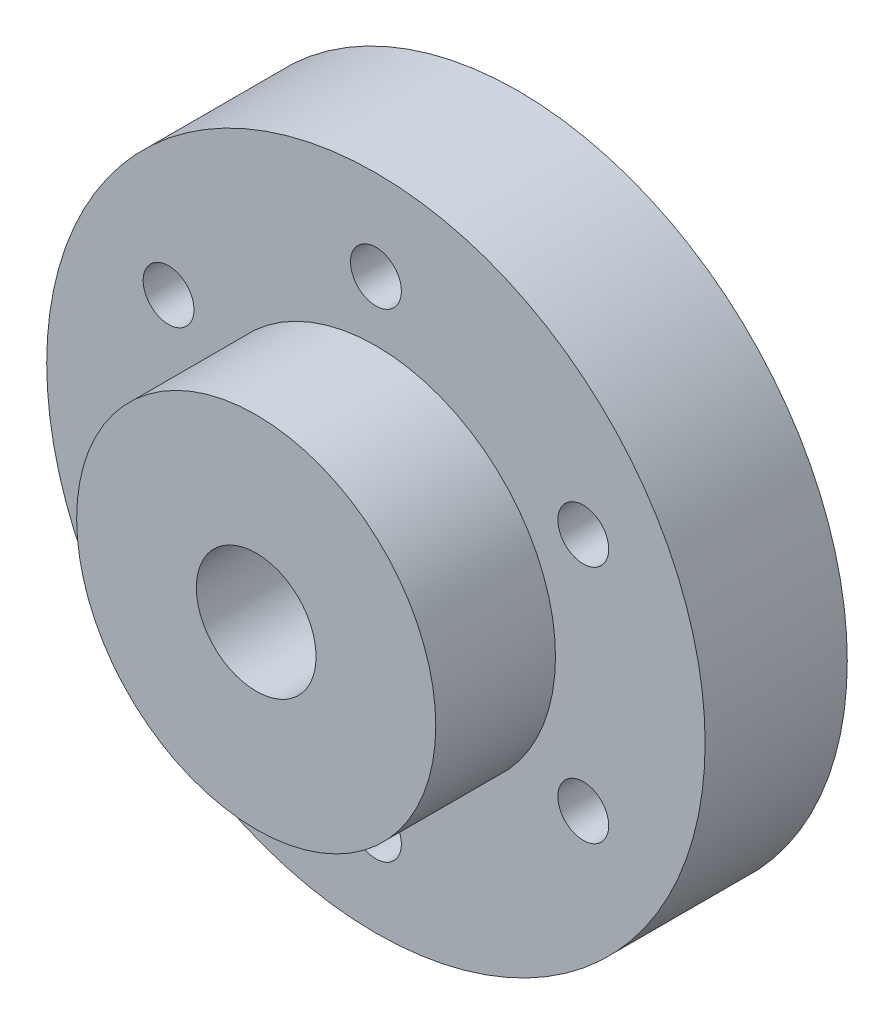
ISO-10303-21;
HEADER;
FILE_DESCRIPTION(('STEP AP214'),'2;1');
FILE_NAME('part.step','',(''),(''),'','','');
FILE_SCHEMA(('AUTOMOTIVE_DESIGN { 1 0 10303 214 1 1 1 1 }'));
ENDSEC;
DATA;
#1=APPLICATION_CONTEXT('core data for automotive mechanical design processes');
#2=APPLICATION_PROTOCOL_DEFINITION('international standard','automotive_design',2000,#1);
#3=PRODUCT_CONTEXT('',#1,'mechanical');
#4=PRODUCT('Part','Part','',(#3));
#5=PRODUCT_RELATED_PRODUCT_CATEGORY('part','',(#4));
#6=PRODUCT_DEFINITION_FORMATION('','',#4);
#7=PRODUCT_DEFINITION_CONTEXT('part definition',#1,'design');
#8=PRODUCT_DEFINITION('design','',#6,#7);
#9=PRODUCT_DEFINITION_SHAPE('','',#8);
#10=(LENGTH_UNIT() NAMED_UNIT(*) SI_UNIT(.MILLI.,.METRE.));
#11=(NAMED_UNIT(*) PLANE_ANGLE_UNIT() SI_UNIT($,.RADIAN.));
#12=(NAMED_UNIT(*) SI_UNIT($,.STERADIAN.) SOLID_ANGLE_UNIT());
#13=UNCERTAINTY_MEASURE_WITH_UNIT(LENGTH_MEASURE(1.E-05),#10,'distance_accuracy_value','');
#14=(GEOMETRIC_REPRESENTATION_CONTEXT(3) GLOBAL_UNCERTAINTY_ASSIGNED_CONTEXT((#13)) GLOBAL_UNIT_ASSIGNED_CONTEXT((#10,
#11,#12)) REPRESENTATION_CONTEXT('',''));
#15=CARTESIAN_POINT('',(0.,0.,0.));
#16=DIRECTION('',(0.,0.,1.));
#17=DIRECTION('',(1.,0.,0.));
#18=AXIS2_PLACEMENT_3D('',#15,#16,#17);
#19=CARTESIAN_POINT('',(0.,0.,75.1));
#20=DIRECTION('',(0.,0.,-1.));
#21=DIRECTION('',(0.,-1.,0.));
#22=AXIS2_PLACEMENT_3D('',#19,#20,#21);
#23=PLANE('',#22);
#24=CARTESIAN_POINT('',(0.,16.,75.1));
#25=DIRECTION('',(0.,0.,-1.));
#26=DIRECTION('',(-1.,0.,0.));
#27=AXIS2_PLACEMENT_3D('',#24,#25,#26);
#28=CIRCLE('',#27,1.7);
#29=CARTESIAN_POINT('',(-1.7,16.,75.1));
#30=VERTEX_POINT('',#29);
#31=EDGE_CURVE('E140',#30,#30,#28,.T.);
#32=ORIENTED_EDGE('',*,*,#31,.T.);
#33=EDGE_LOOP('',(#32));
#34=FACE_BOUND('',#33,.T.);
#35=CARTESIAN_POINT('',(-13.856406460551,8.,75.1));
#36=DIRECTION('',(0.,0.,-1.));
#37=DIRECTION('',(-1.,0.,0.));
#38=AXIS2_PLACEMENT_3D('',#35,#36,#37);
#39=CIRCLE('',#38,1.7);
#40=CARTESIAN_POINT('',(-15.556406460551,8.,75.1));
#41=VERTEX_POINT('',#40);
#42=EDGE_CURVE('E128',#41,#41,#39,.T.);
#43=ORIENTED_EDGE('',*,*,#42,.T.);
#44=EDGE_LOOP('',(#43));
#45=FACE_BOUND('',#44,.T.);
#46=CARTESIAN_POINT('',(-13.856406460551,-8.,75.1));
#47=DIRECTION('',(0.,0.,-1.));
#48=DIRECTION('',(-1.,0.,0.));
#49=AXIS2_PLACEMENT_3D('',#46,#47,#48);
#50=CIRCLE('',#49,1.7);
#51=CARTESIAN_POINT('',(-15.556406460551,-8.,75.1));
#52=VERTEX_POINT('',#51);
#53=EDGE_CURVE('E116',#52,#52,#50,.T.);
#54=ORIENTED_EDGE('',*,*,#53,.T.);
#55=EDGE_LOOP('',(#54));
#56=FACE_BOUND('',#55,.T.);
#57=CARTESIAN_POINT('',(0.,-16.,75.1));
#58=DIRECTION('',(0.,0.,-1.));
#59=DIRECTION('',(-1.,0.,0.));
#60=AXIS2_PLACEMENT_3D('',#57,#58,#59);
#61=CIRCLE('',#60,1.7);
#62=CARTESIAN_POINT('',(-1.7,-16.,75.1));
#63=VERTEX_POINT('',#62);
#64=EDGE_CURVE('E104',#63,#63,#61,.T.);
#65=ORIENTED_EDGE('',*,*,#64,.T.);
#66=EDGE_LOOP('',(#65));
#67=FACE_BOUND('',#66,.T.);
#68=CARTESIAN_POINT('',(13.856406460551,-8.00000000000001,75.1));
#69=DIRECTION('',(0.,0.,-1.));
#70=DIRECTION('',(-1.,0.,0.));
#71=AXIS2_PLACEMENT_3D('',#68,#69,#70);
#72=CIRCLE('',#71,1.7);
#73=CARTESIAN_POINT('',(12.156406460551,-8.00000000000001,75.1));
#74=VERTEX_POINT('',#73);
#75=EDGE_CURVE('E92',#74,#74,#72,.T.);
#76=ORIENTED_EDGE('',*,*,#75,.T.);
#77=EDGE_LOOP('',(#76));
#78=FACE_BOUND('',#77,.T.);
#79=CARTESIAN_POINT('',(13.856406460551,8.,75.1));
#80=DIRECTION('',(0.,0.,-1.));
#81=DIRECTION('',(-1.,0.,0.));
#82=AXIS2_PLACEMENT_3D('',#79,#80,#81);
#83=CIRCLE('',#82,1.7);
#84=CARTESIAN_POINT('',(12.156406460551,8.,75.1));
#85=VERTEX_POINT('',#84);
#86=EDGE_CURVE('E67',#85,#85,#83,.T.);
#87=ORIENTED_EDGE('',*,*,#86,.T.);
#88=EDGE_LOOP('',(#87));
#89=FACE_BOUND('',#88,.T.);
#90=CARTESIAN_POINT('',(0.,0.,75.1));
#91=DIRECTION('',(0.,0.,-1.));
#92=DIRECTION('',(-1.,0.,0.));
#93=AXIS2_PLACEMENT_3D('',#90,#91,#92);
#94=CIRCLE('',#93,22.);
#95=CARTESIAN_POINT('',(-22.,0.,75.1));
#96=VERTEX_POINT('',#95);
#97=EDGE_CURVE('E42',#96,#96,#94,.T.);
#98=ORIENTED_EDGE('',*,*,#97,.F.);
#99=EDGE_LOOP('',(#98));
#100=FACE_BOUND('',#99,.T.);
#101=CARTESIAN_POINT('',(0.,0.,75.1));
#102=DIRECTION('',(0.,0.,-1.));
#103=DIRECTION('',(1.,0.,0.));
#104=AXIS2_PLACEMENT_3D('',#101,#102,#103);
#105=CIRCLE('',#104,12.);
#106=CARTESIAN_POINT('',(-12.,0.,75.1));
#107=VERTEX_POINT('',#106);
#108=EDGE_CURVE('E11',#107,#107,#105,.T.);
#109=ORIENTED_EDGE('',*,*,#108,.T.);
#110=EDGE_LOOP('',(#109));
#111=FACE_BOUND('',#110,.T.);
#112=ADVANCED_FACE('F34',(#34,#45,#56,#67,#78,#89,#100,#111),#23,.F.);
#113=CARTESIAN_POINT('',(0.,0.,75.1));
#114=DIRECTION('',(0.,0.,-1.));
#115=DIRECTION('',(-1.,0.,0.));
#116=AXIS2_PLACEMENT_3D('',#113,#114,#115);
#117=CYLINDRICAL_SURFACE('',#116,22.);
#118=ORIENTED_EDGE('',*,*,#97,.T.);
#119=EDGE_LOOP('',(#118));
#120=FACE_BOUND('',#119,.T.);
#121=CARTESIAN_POINT('',(0.,0.,65.6));
#122=DIRECTION('',(0.,0.,-1.));
#123=DIRECTION('',(-1.,0.,0.));
#124=AXIS2_PLACEMENT_3D('',#121,#122,#123);
#125=CIRCLE('',#124,22.);
#126=CARTESIAN_POINT('',(-22.,0.,65.6));
#127=VERTEX_POINT('',#126);
#128=EDGE_CURVE('E72',#127,#127,#125,.T.);
#129=ORIENTED_EDGE('',*,*,#128,.F.);
#130=EDGE_LOOP('',(#129));
#131=FACE_BOUND('',#130,.T.);
#132=ADVANCED_FACE('F159',(#120,#131),#117,.T.);
#133=CARTESIAN_POINT('',(0.,0.,65.6));
#134=DIRECTION('',(0.,0.,-1.));
#135=DIRECTION('',(0.,-1.,0.));
#136=AXIS2_PLACEMENT_3D('',#133,#134,#135);
#137=PLANE('',#136);
#138=CARTESIAN_POINT('',(0.,16.,65.6));
#139=DIRECTION('',(0.,0.,-1.));
#140=DIRECTION('',(-1.,0.,0.));
#141=AXIS2_PLACEMENT_3D('',#138,#139,#140);
#142=CIRCLE('',#141,3.5);
#143=CARTESIAN_POINT('',(-3.5,16.,65.6));
#144=VERTEX_POINT('',#143);
#145=EDGE_CURVE('E149',#144,#144,#142,.T.);
#146=ORIENTED_EDGE('',*,*,#145,.F.);
#147=EDGE_LOOP('',(#146));
#148=FACE_BOUND('',#147,.T.);
#149=CARTESIAN_POINT('',(-13.856406460551,8.,65.6));
#150=DIRECTION('',(0.,0.,-1.));
#151=DIRECTION('',(-1.,0.,0.));
#152=AXIS2_PLACEMENT_3D('',#149,#150,#151);
#153=CIRCLE('',#152,3.5);
#154=CARTESIAN_POINT('',(-17.356406460551,8.,65.6));
#155=VERTEX_POINT('',#154);
#156=EDGE_CURVE('E137',#155,#155,#153,.T.);
#157=ORIENTED_EDGE('',*,*,#156,.F.);
#158=EDGE_LOOP('',(#157));
#159=FACE_BOUND('',#158,.T.);
#160=CARTESIAN_POINT('',(-13.856406460551,-8.,65.6));
#161=DIRECTION('',(0.,0.,-1.));
#162=DIRECTION('',(-1.,0.,0.));
#163=AXIS2_PLACEMENT_3D('',#160,#161,#162);
#164=CIRCLE('',#163,3.5);
#165=CARTESIAN_POINT('',(-17.356406460551,-8.,65.6));
#166=VERTEX_POINT('',#165);
#167=EDGE_CURVE('E125',#166,#166,#164,.T.);
#168=ORIENTED_EDGE('',*,*,#167,.F.);
#169=EDGE_LOOP('',(#168));
#170=FACE_BOUND('',#169,.T.);
#171=CARTESIAN_POINT('',(0.,-16.,65.6));
#172=DIRECTION('',(0.,0.,-1.));
#173=DIRECTION('',(-1.,0.,0.));
#174=AXIS2_PLACEMENT_3D('',#171,#172,#173);
#175=CIRCLE('',#174,3.5);
#176=CARTESIAN_POINT('',(-3.5,-16.,65.6));
#177=VERTEX_POINT('',#176);
#178=EDGE_CURVE('E113',#177,#177,#175,.T.);
#179=ORIENTED_EDGE('',*,*,#178,.F.);
#180=EDGE_LOOP('',(#179));
#181=FACE_BOUND('',#180,.T.);
#182=CARTESIAN_POINT('',(13.856406460551,-8.00000000000001,65.6));
#183=DIRECTION('',(0.,0.,-1.));
#184=DIRECTION('',(-1.,0.,0.));
#185=AXIS2_PLACEMENT_3D('',#182,#183,#184);
#186=CIRCLE('',#185,3.5);
#187=CARTESIAN_POINT('',(10.356406460551,-8.00000000000001,65.6));
#188=VERTEX_POINT('',#187);
#189=EDGE_CURVE('E101',#188,#188,#186,.T.);
#190=ORIENTED_EDGE('',*,*,#189,.F.);
#191=EDGE_LOOP('',(#190));
#192=FACE_BOUND('',#191,.T.);
#193=CARTESIAN_POINT('',(13.856406460551,8.,65.6));
#194=DIRECTION('',(0.,0.,-1.));
#195=DIRECTION('',(-1.,0.,0.));
#196=AXIS2_PLACEMENT_3D('',#193,#194,#195);
#197=CIRCLE('',#196,3.49999999999999);
#198=CARTESIAN_POINT('',(10.356406460551,8.,65.6));
#199=VERTEX_POINT('',#198);
#200=EDGE_CURVE('E89',#199,#199,#197,.T.);
#201=ORIENTED_EDGE('',*,*,#200,.F.);
#202=EDGE_LOOP('',(#201));
#203=FACE_BOUND('',#202,.T.);
#204=ORIENTED_EDGE('',*,*,#128,.T.);
#205=EDGE_LOOP('',(#204));
#206=FACE_BOUND('',#205,.T.);
#207=CARTESIAN_POINT('',(0.,0.,65.6));
#208=DIRECTION('',(0.,0.,1.));
#209=DIRECTION('',(-1.,0.,0.));
#210=AXIS2_PLACEMENT_3D('',#207,#208,#209);
#211=CIRCLE('',#210,4.);
#212=CARTESIAN_POINT('',(-3.99999999999999,0.,65.6));
#213=VERTEX_POINT('',#212);
#214=EDGE_CURVE('E73',#213,#213,#211,.T.);
#215=ORIENTED_EDGE('',*,*,#214,.T.);
#216=EDGE_LOOP('',(#215));
#217=FACE_BOUND('',#216,.T.);
#218=ADVANCED_FACE('F155',(#148,#159,#170,#181,#192,#203,#206,#217),#137,.T.);
#219=CARTESIAN_POINT('',(0.,0.,83.1));
#220=DIRECTION('',(0.,0.,-1.));
#221=DIRECTION('',(1.,0.,0.));
#222=AXIS2_PLACEMENT_3D('',#219,#220,#221);
#223=CYLINDRICAL_SURFACE('',#222,4.);
#224=DIRECTION('',(0.,0.,1.));
#225=VECTOR('',#224,1.);
#226=CARTESIAN_POINT('',(-4.,0.,83.1));
#227=LINE('',#226,#225);
#228=CARTESIAN_POINT('',(-4.,0.,75.1));
#229=VERTEX_POINT('',#228);
#230=CARTESIAN_POINT('',(-4.,0.,83.1));
#231=VERTEX_POINT('',#230);
#232=EDGE_CURVE('E49',#229,#231,#227,.T.);
#233=ORIENTED_EDGE('',*,*,#232,.F.);
#234=ORIENTED_EDGE('',*,*,#232,.T.);
#235=CARTESIAN_POINT('',(0.,0.,83.1));
#236=DIRECTION('',(0.,0.,-1.));
#237=DIRECTION('',(1.,0.,0.));
#238=AXIS2_PLACEMENT_3D('',#235,#236,#237);
#239=CIRCLE('',#238,4.);
#240=EDGE_CURVE('E37',#231,#231,#239,.T.);
#241=ORIENTED_EDGE('',*,*,#240,.F.);
#242=EDGE_LOOP('',(#233,#234,#241));
#243=FACE_BOUND('',#242,.T.);
#244=ORIENTED_EDGE('',*,*,#214,.F.);
#245=EDGE_LOOP('',(#244));
#246=FACE_BOUND('',#245,.T.);
#247=ADVANCED_FACE('F158',(#243,#246),#223,.F.);
#248=CARTESIAN_POINT('',(0.,0.,83.1));
#249=DIRECTION('',(0.,0.,-1.));
#250=DIRECTION('',(1.,0.,0.));
#251=AXIS2_PLACEMENT_3D('',#248,#249,#250);
#252=CYLINDRICAL_SURFACE('',#251,12.);
#253=ORIENTED_EDGE('',*,*,#108,.F.);
#254=DIRECTION('',(0.,0.,1.));
#255=VECTOR('',#254,1.);
#256=CARTESIAN_POINT('',(-12.,0.,83.1));
#257=LINE('',#256,#255);
#258=CARTESIAN_POINT('',(-12.,0.,83.1));
#259=VERTEX_POINT('',#258);
#260=EDGE_CURVE('E62',#107,#259,#257,.T.);
#261=ORIENTED_EDGE('',*,*,#260,.T.);
#262=CARTESIAN_POINT('',(0.,0.,83.1));
#263=DIRECTION('',(0.,0.,1.));
#264=DIRECTION('',(1.,0.,0.));
#265=AXIS2_PLACEMENT_3D('',#262,#263,#264);
#266=CIRCLE('',#265,12.);
#267=EDGE_CURVE('E60',#259,#259,#266,.T.);
#268=ORIENTED_EDGE('',*,*,#267,.F.);
#269=ORIENTED_EDGE('',*,*,#260,.F.);
#270=EDGE_LOOP('',(#253,#261,#268,#269));
#271=FACE_BOUND('',#270,.T.);
#272=ADVANCED_FACE('F61',(#271),#252,.T.);
#273=CARTESIAN_POINT('',(0.,0.,83.1));
#274=DIRECTION('',(0.,0.,1.));
#275=DIRECTION('',(1.,0.,0.));
#276=AXIS2_PLACEMENT_3D('',#273,#274,#275);
#277=PLANE('',#276);
#278=ORIENTED_EDGE('',*,*,#267,.T.);
#279=EDGE_LOOP('',(#278));
#280=FACE_BOUND('',#279,.T.);
#281=ORIENTED_EDGE('',*,*,#240,.T.);
#282=EDGE_LOOP('',(#281));
#283=FACE_BOUND('',#282,.T.);
#284=ADVANCED_FACE('F212',(#280,#283),#277,.T.);
#285=CARTESIAN_POINT('',(13.856406460551,8.,65.6));
#286=DIRECTION('',(0.,0.,-1.));
#287=DIRECTION('',(-1.,0.,0.));
#288=AXIS2_PLACEMENT_3D('',#285,#286,#287);
#289=CYLINDRICAL_SURFACE('',#288,1.7);
#290=ORIENTED_EDGE('',*,*,#86,.F.);
#291=EDGE_LOOP('',(#290));
#292=FACE_BOUND('',#291,.T.);
#293=CARTESIAN_POINT('',(13.856406460551,8.,68.));
#294=DIRECTION('',(0.,0.,-1.));
#295=DIRECTION('',(-1.,0.,0.));
#296=AXIS2_PLACEMENT_3D('',#293,#294,#295);
#297=CIRCLE('',#296,1.7);
#298=CARTESIAN_POINT('',(12.156406460551,8.,68.));
#299=VERTEX_POINT('',#298);
#300=EDGE_CURVE('E83',#299,#299,#297,.T.);
#301=ORIENTED_EDGE('',*,*,#300,.T.);
#302=EDGE_LOOP('',(#301));
#303=FACE_BOUND('',#302,.T.);
#304=ADVANCED_FACE('F184',(#292,#303),#289,.F.);
#305=CARTESIAN_POINT('',(15.556406460551,8.,68.));
#306=DIRECTION('',(0.,0.,1.));
#307=DIRECTION('',(1.,0.,0.));
#308=AXIS2_PLACEMENT_3D('',#305,#306,#307);
#309=PLANE('',#308);
#310=ORIENTED_EDGE('',*,*,#300,.F.);
#311=EDGE_LOOP('',(#310));
#312=FACE_BOUND('',#311,.T.);
#313=CARTESIAN_POINT('',(13.856406460551,8.,68.));
#314=DIRECTION('',(0.,0.,-1.));
#315=DIRECTION('',(-1.,0.,0.));
#316=AXIS2_PLACEMENT_3D('',#313,#314,#315);
#317=CIRCLE('',#316,3.49999999999999);
#318=CARTESIAN_POINT('',(10.356406460551,8.,68.));
#319=VERTEX_POINT('',#318);
#320=EDGE_CURVE('E86',#319,#319,#317,.T.);
#321=ORIENTED_EDGE('',*,*,#320,.T.);
#322=EDGE_LOOP('',(#321));
#323=FACE_BOUND('',#322,.T.);
#324=ADVANCED_FACE('F174',(#312,#323),#309,.F.);
#325=CARTESIAN_POINT('',(13.856406460551,8.,65.6));
#326=DIRECTION('',(0.,0.,-1.));
#327=DIRECTION('',(-1.,0.,0.));
#328=AXIS2_PLACEMENT_3D('',#325,#326,#327);
#329=CYLINDRICAL_SURFACE('',#328,3.49999999999999);
#330=ORIENTED_EDGE('',*,*,#320,.F.);
#331=EDGE_LOOP('',(#330));
#332=FACE_BOUND('',#331,.T.);
#333=ORIENTED_EDGE('',*,*,#200,.T.);
#334=EDGE_LOOP('',(#333));
#335=FACE_BOUND('',#334,.T.);
#336=ADVANCED_FACE('F171',(#332,#335),#329,.F.);
#337=CARTESIAN_POINT('',(13.856406460551,-8.00000000000001,65.6));
#338=DIRECTION('',(0.,0.,-1.));
#339=DIRECTION('',(-1.,0.,0.));
#340=AXIS2_PLACEMENT_3D('',#337,#338,#339);
#341=CYLINDRICAL_SURFACE('',#340,1.7);
#342=ORIENTED_EDGE('',*,*,#75,.F.);
#343=EDGE_LOOP('',(#342));
#344=FACE_BOUND('',#343,.T.);
#345=CARTESIAN_POINT('',(13.856406460551,-8.00000000000001,68.));
#346=DIRECTION('',(0.,0.,-1.));
#347=DIRECTION('',(-1.,0.,0.));
#348=AXIS2_PLACEMENT_3D('',#345,#346,#347);
#349=CIRCLE('',#348,1.7);
#350=CARTESIAN_POINT('',(12.156406460551,-8.00000000000001,68.));
#351=VERTEX_POINT('',#350);
#352=EDGE_CURVE('E95',#351,#351,#349,.T.);
#353=ORIENTED_EDGE('',*,*,#352,.T.);
#354=EDGE_LOOP('',(#353));
#355=FACE_BOUND('',#354,.T.);
#356=ADVANCED_FACE('F173',(#344,#355),#341,.F.);
#357=CARTESIAN_POINT('',(15.556406460551,-8.00000000000001,68.));
#358=DIRECTION('',(0.,0.,1.));
#359=DIRECTION('',(1.,0.,0.));
#360=AXIS2_PLACEMENT_3D('',#357,#358,#359);
#361=PLANE('',#360);
#362=ORIENTED_EDGE('',*,*,#352,.F.);
#363=EDGE_LOOP('',(#362));
#364=FACE_BOUND('',#363,.T.);
#365=CARTESIAN_POINT('',(13.856406460551,-8.00000000000001,68.));
#366=DIRECTION('',(0.,0.,-1.));
#367=DIRECTION('',(-1.,0.,0.));
#368=AXIS2_PLACEMENT_3D('',#365,#366,#367);
#369=CIRCLE('',#368,3.5);
#370=CARTESIAN_POINT('',(10.356406460551,-8.00000000000001,68.));
#371=VERTEX_POINT('',#370);
#372=EDGE_CURVE('E98',#371,#371,#369,.T.);
#373=ORIENTED_EDGE('',*,*,#372,.T.);
#374=EDGE_LOOP('',(#373));
#375=FACE_BOUND('',#374,.T.);
#376=ADVANCED_FACE('F181',(#364,#375),#361,.F.);
#377=CARTESIAN_POINT('',(13.856406460551,-8.00000000000001,65.6));
#378=DIRECTION('',(0.,0.,-1.));
#379=DIRECTION('',(-1.,0.,0.));
#380=AXIS2_PLACEMENT_3D('',#377,#378,#379);
#381=CYLINDRICAL_SURFACE('',#380,3.5);
#382=ORIENTED_EDGE('',*,*,#372,.F.);
#383=EDGE_LOOP('',(#382));
#384=FACE_BOUND('',#383,.T.);
#385=ORIENTED_EDGE('',*,*,#189,.T.);
#386=EDGE_LOOP('',(#385));
#387=FACE_BOUND('',#386,.T.);
#388=ADVANCED_FACE('F288',(#384,#387),#381,.F.);
#389=CARTESIAN_POINT('',(0.,-16.,65.6));
#390=DIRECTION('',(0.,0.,-1.));
#391=DIRECTION('',(-1.,0.,0.));
#392=AXIS2_PLACEMENT_3D('',#389,#390,#391);
#393=CYLINDRICAL_SURFACE('',#392,1.7);
#394=ORIENTED_EDGE('',*,*,#64,.F.);
#395=EDGE_LOOP('',(#394));
#396=FACE_BOUND('',#395,.T.);
#397=CARTESIAN_POINT('',(0.,-16.,68.));
#398=DIRECTION('',(0.,0.,-1.));
#399=DIRECTION('',(-1.,0.,0.));
#400=AXIS2_PLACEMENT_3D('',#397,#398,#399);
#401=CIRCLE('',#400,1.7);
#402=CARTESIAN_POINT('',(-1.7,-16.,68.));
#403=VERTEX_POINT('',#402);
#404=EDGE_CURVE('E107',#403,#403,#401,.T.);
#405=ORIENTED_EDGE('',*,*,#404,.T.);
#406=EDGE_LOOP('',(#405));
#407=FACE_BOUND('',#406,.T.);
#408=ADVANCED_FACE('F297',(#396,#407),#393,.F.);
#409=CARTESIAN_POINT('',(1.7,-16.,68.));
#410=DIRECTION('',(0.,0.,1.));
#411=DIRECTION('',(1.,0.,0.));
#412=AXIS2_PLACEMENT_3D('',#409,#410,#411);
#413=PLANE('',#412);
#414=ORIENTED_EDGE('',*,*,#404,.F.);
#415=EDGE_LOOP('',(#414));
#416=FACE_BOUND('',#415,.T.);
#417=CARTESIAN_POINT('',(0.,-16.,68.));
#418=DIRECTION('',(0.,0.,-1.));
#419=DIRECTION('',(-1.,0.,0.));
#420=AXIS2_PLACEMENT_3D('',#417,#418,#419);
#421=CIRCLE('',#420,3.5);
#422=CARTESIAN_POINT('',(-3.5,-16.,68.));
#423=VERTEX_POINT('',#422);
#424=EDGE_CURVE('E110',#423,#423,#421,.T.);
#425=ORIENTED_EDGE('',*,*,#424,.T.);
#426=EDGE_LOOP('',(#425));
#427=FACE_BOUND('',#426,.T.);
#428=ADVANCED_FACE('F306',(#416,#427),#413,.F.);
#429=CARTESIAN_POINT('',(0.,-16.,65.6));
#430=DIRECTION('',(0.,0.,-1.));
#431=DIRECTION('',(-1.,0.,0.));
#432=AXIS2_PLACEMENT_3D('',#429,#430,#431);
#433=CYLINDRICAL_SURFACE('',#432,3.5);
#434=ORIENTED_EDGE('',*,*,#424,.F.);
#435=EDGE_LOOP('',(#434));
#436=FACE_BOUND('',#435,.T.);
#437=ORIENTED_EDGE('',*,*,#178,.T.);
#438=EDGE_LOOP('',(#437));
#439=FACE_BOUND('',#438,.T.);
#440=ADVANCED_FACE('F315',(#436,#439),#433,.F.);
#441=CARTESIAN_POINT('',(-13.856406460551,-8.,65.6));
#442=DIRECTION('',(0.,0.,-1.));
#443=DIRECTION('',(-1.,0.,0.));
#444=AXIS2_PLACEMENT_3D('',#441,#442,#443);
#445=CYLINDRICAL_SURFACE('',#444,1.7);
#446=ORIENTED_EDGE('',*,*,#53,.F.);
#447=EDGE_LOOP('',(#446));
#448=FACE_BOUND('',#447,.T.);
#449=CARTESIAN_POINT('',(-13.856406460551,-8.,68.));
#450=DIRECTION('',(0.,0.,-1.));
#451=DIRECTION('',(-1.,0.,0.));
#452=AXIS2_PLACEMENT_3D('',#449,#450,#451);
#453=CIRCLE('',#452,1.7);
#454=CARTESIAN_POINT('',(-15.556406460551,-8.,68.));
#455=VERTEX_POINT('',#454);
#456=EDGE_CURVE('E119',#455,#455,#453,.T.);
#457=ORIENTED_EDGE('',*,*,#456,.T.);
#458=EDGE_LOOP('',(#457));
#459=FACE_BOUND('',#458,.T.);
#460=ADVANCED_FACE('F324',(#448,#459),#445,.F.);
#461=CARTESIAN_POINT('',(-12.156406460551,-8.,68.));
#462=DIRECTION('',(0.,0.,1.));
#463=DIRECTION('',(1.,0.,0.));
#464=AXIS2_PLACEMENT_3D('',#461,#462,#463);
#465=PLANE('',#464);
#466=ORIENTED_EDGE('',*,*,#456,.F.);
#467=EDGE_LOOP('',(#466));
#468=FACE_BOUND('',#467,.T.);
#469=CARTESIAN_POINT('',(-13.856406460551,-8.,68.));
#470=DIRECTION('',(0.,0.,-1.));
#471=DIRECTION('',(-1.,0.,0.));
#472=AXIS2_PLACEMENT_3D('',#469,#470,#471);
#473=CIRCLE('',#472,3.5);
#474=CARTESIAN_POINT('',(-17.356406460551,-8.,68.));
#475=VERTEX_POINT('',#474);
#476=EDGE_CURVE('E122',#475,#475,#473,.T.);
#477=ORIENTED_EDGE('',*,*,#476,.T.);
#478=EDGE_LOOP('',(#477));
#479=FACE_BOUND('',#478,.T.);
#480=ADVANCED_FACE('F333',(#468,#479),#465,.F.);
#481=CARTESIAN_POINT('',(-13.856406460551,-8.,65.6));
#482=DIRECTION('',(0.,0.,-1.));
#483=DIRECTION('',(-1.,0.,0.));
#484=AXIS2_PLACEMENT_3D('',#481,#482,#483);
#485=CYLINDRICAL_SURFACE('',#484,3.5);
#486=ORIENTED_EDGE('',*,*,#476,.F.);
#487=EDGE_LOOP('',(#486));
#488=FACE_BOUND('',#487,.T.);
#489=ORIENTED_EDGE('',*,*,#167,.T.);
#490=EDGE_LOOP('',(#489));
#491=FACE_BOUND('',#490,.T.);
#492=ADVANCED_FACE('F342',(#488,#491),#485,.F.);
#493=CARTESIAN_POINT('',(-13.856406460551,8.,65.6));
#494=DIRECTION('',(0.,0.,-1.));
#495=DIRECTION('',(-1.,0.,0.));
#496=AXIS2_PLACEMENT_3D('',#493,#494,#495);
#497=CYLINDRICAL_SURFACE('',#496,1.7);
#498=ORIENTED_EDGE('',*,*,#42,.F.);
#499=EDGE_LOOP('',(#498));
#500=FACE_BOUND('',#499,.T.);
#501=CARTESIAN_POINT('',(-13.856406460551,8.,68.));
#502=DIRECTION('',(0.,0.,-1.));
#503=DIRECTION('',(-1.,0.,0.));
#504=AXIS2_PLACEMENT_3D('',#501,#502,#503);
#505=CIRCLE('',#504,1.7);
#506=CARTESIAN_POINT('',(-15.556406460551,8.,68.));
#507=VERTEX_POINT('',#506);
#508=EDGE_CURVE('E131',#507,#507,#505,.T.);
#509=ORIENTED_EDGE('',*,*,#508,.T.);
#510=EDGE_LOOP('',(#509));
#511=FACE_BOUND('',#510,.T.);
#512=ADVANCED_FACE('F351',(#500,#511),#497,.F.);
#513=CARTESIAN_POINT('',(-12.156406460551,8.,68.));
#514=DIRECTION('',(0.,0.,1.));
#515=DIRECTION('',(1.,0.,0.));
#516=AXIS2_PLACEMENT_3D('',#513,#514,#515);
#517=PLANE('',#516);
#518=ORIENTED_EDGE('',*,*,#508,.F.);
#519=EDGE_LOOP('',(#518));
#520=FACE_BOUND('',#519,.T.);
#521=CARTESIAN_POINT('',(-13.856406460551,8.,68.));
#522=DIRECTION('',(0.,0.,-1.));
#523=DIRECTION('',(-1.,0.,0.));
#524=AXIS2_PLACEMENT_3D('',#521,#522,#523);
#525=CIRCLE('',#524,3.5);
#526=CARTESIAN_POINT('',(-17.356406460551,8.,68.));
#527=VERTEX_POINT('',#526);
#528=EDGE_CURVE('E134',#527,#527,#525,.T.);
#529=ORIENTED_EDGE('',*,*,#528,.T.);
#530=EDGE_LOOP('',(#529));
#531=FACE_BOUND('',#530,.T.);
#532=ADVANCED_FACE('F360',(#520,#531),#517,.F.);
#533=CARTESIAN_POINT('',(-13.856406460551,8.,65.6));
#534=DIRECTION('',(0.,0.,-1.));
#535=DIRECTION('',(-1.,0.,0.));
#536=AXIS2_PLACEMENT_3D('',#533,#534,#535);
#537=CYLINDRICAL_SURFACE('',#536,3.5);
#538=ORIENTED_EDGE('',*,*,#528,.F.);
#539=EDGE_LOOP('',(#538));
#540=FACE_BOUND('',#539,.T.);
#541=ORIENTED_EDGE('',*,*,#156,.T.);
#542=EDGE_LOOP('',(#541));
#543=FACE_BOUND('',#542,.T.);
#544=ADVANCED_FACE('F369',(#540,#543),#537,.F.);
#545=CARTESIAN_POINT('',(0.,16.,65.6));
#546=DIRECTION('',(0.,0.,-1.));
#547=DIRECTION('',(-1.,0.,0.));
#548=AXIS2_PLACEMENT_3D('',#545,#546,#547);
#549=CYLINDRICAL_SURFACE('',#548,1.7);
#550=ORIENTED_EDGE('',*,*,#31,.F.);
#551=EDGE_LOOP('',(#550));
#552=FACE_BOUND('',#551,.T.);
#553=CARTESIAN_POINT('',(0.,16.,68.));
#554=DIRECTION('',(0.,0.,-1.));
#555=DIRECTION('',(-1.,0.,0.));
#556=AXIS2_PLACEMENT_3D('',#553,#554,#555);
#557=CIRCLE('',#556,1.7);
#558=CARTESIAN_POINT('',(-1.7,16.,68.));
#559=VERTEX_POINT('',#558);
#560=EDGE_CURVE('E143',#559,#559,#557,.T.);
#561=ORIENTED_EDGE('',*,*,#560,.T.);
#562=EDGE_LOOP('',(#561));
#563=FACE_BOUND('',#562,.T.);
#564=ADVANCED_FACE('F378',(#552,#563),#549,.F.);
#565=CARTESIAN_POINT('',(1.7,16.,68.));
#566=DIRECTION('',(0.,0.,1.));
#567=DIRECTION('',(1.,0.,0.));
#568=AXIS2_PLACEMENT_3D('',#565,#566,#567);
#569=PLANE('',#568);
#570=ORIENTED_EDGE('',*,*,#560,.F.);
#571=EDGE_LOOP('',(#570));
#572=FACE_BOUND('',#571,.T.);
#573=CARTESIAN_POINT('',(0.,16.,68.));
#574=DIRECTION('',(0.,0.,-1.));
#575=DIRECTION('',(-1.,0.,0.));
#576=AXIS2_PLACEMENT_3D('',#573,#574,#575);
#577=CIRCLE('',#576,3.5);
#578=CARTESIAN_POINT('',(-3.5,16.,68.));
#579=VERTEX_POINT('',#578);
#580=EDGE_CURVE('E146',#579,#579,#577,.T.);
#581=ORIENTED_EDGE('',*,*,#580,.T.);
#582=EDGE_LOOP('',(#581));
#583=FACE_BOUND('',#582,.T.);
#584=ADVANCED_FACE('F387',(#572,#583),#569,.F.);
#585=CARTESIAN_POINT('',(0.,16.,65.6));
#586=DIRECTION('',(0.,0.,-1.));
#587=DIRECTION('',(-1.,0.,0.));
#588=AXIS2_PLACEMENT_3D('',#585,#586,#587);
#589=CYLINDRICAL_SURFACE('',#588,3.5);
#590=ORIENTED_EDGE('',*,*,#580,.F.);
#591=EDGE_LOOP('',(#590));
#592=FACE_BOUND('',#591,.T.);
#593=ORIENTED_EDGE('',*,*,#145,.T.);
#594=EDGE_LOOP('',(#593));
#595=FACE_BOUND('',#594,.T.);
#596=ADVANCED_FACE('F153',(#592,#595),#589,.F.);
#597=CLOSED_SHELL('',(#112,#132,#218,#247,#272,#284,#304,#324,#336,#356,#376,#388,#408,#428,
#440,#460,#480,#492,#512,#532,#544,#564,#584,#596));
#598=MANIFOLD_SOLID_BREP('B2',#597);
#599=ADVANCED_BREP_SHAPE_REPRESENTATION('',(#18,#598),#14);
#600=SHAPE_DEFINITION_REPRESENTATION(#9,#599);
ENDSEC;
END-ISO-10303-21;
